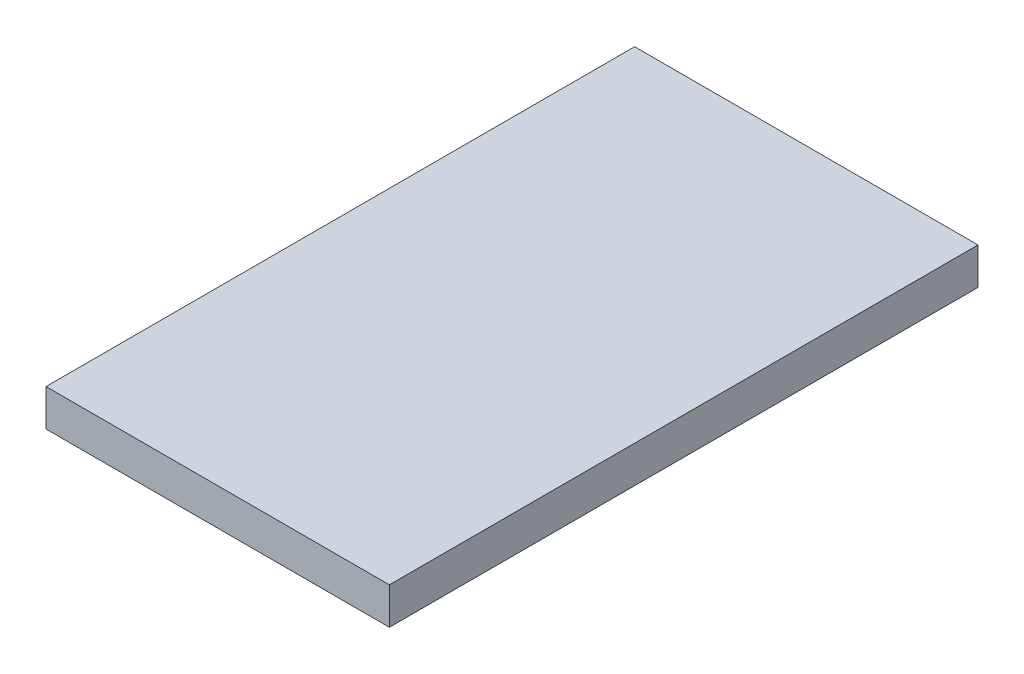
ISO-10303-21;
HEADER;
FILE_DESCRIPTION(('STEP AP214'),'2;1');
FILE_NAME('part.step','',(''),(''),'','','');
FILE_SCHEMA(('AUTOMOTIVE_DESIGN { 1 0 10303 214 1 1 1 1 }'));
ENDSEC;
DATA;
#1=APPLICATION_CONTEXT('core data for automotive mechanical design processes');
#2=APPLICATION_PROTOCOL_DEFINITION('international standard','automotive_design',2000,#1);
#3=PRODUCT_CONTEXT('',#1,'mechanical');
#4=PRODUCT('Part','Part','',(#3));
#5=PRODUCT_RELATED_PRODUCT_CATEGORY('part','',(#4));
#6=PRODUCT_DEFINITION_FORMATION('','',#4);
#7=PRODUCT_DEFINITION_CONTEXT('part definition',#1,'design');
#8=PRODUCT_DEFINITION('design','',#6,#7);
#9=PRODUCT_DEFINITION_SHAPE('','',#8);
#10=(LENGTH_UNIT() NAMED_UNIT(*) SI_UNIT(.MILLI.,.METRE.));
#11=(NAMED_UNIT(*) PLANE_ANGLE_UNIT() SI_UNIT($,.RADIAN.));
#12=(NAMED_UNIT(*) SI_UNIT($,.STERADIAN.) SOLID_ANGLE_UNIT());
#13=UNCERTAINTY_MEASURE_WITH_UNIT(LENGTH_MEASURE(1.E-05),#10,'distance_accuracy_value','');
#14=(GEOMETRIC_REPRESENTATION_CONTEXT(3) GLOBAL_UNCERTAINTY_ASSIGNED_CONTEXT((#13)) GLOBAL_UNIT_ASSIGNED_CONTEXT((#10,
#11,#12)) REPRESENTATION_CONTEXT('',''));
#15=CARTESIAN_POINT('',(0.,0.,0.));
#16=DIRECTION('',(0.,0.,1.));
#17=DIRECTION('',(1.,0.,0.));
#18=AXIS2_PLACEMENT_3D('',#15,#16,#17);
#19=CARTESIAN_POINT('',(88.9,9.525,152.4));
#20=DIRECTION('',(-1.,0.,0.));
#21=DIRECTION('',(0.,0.,1.));
#22=AXIS2_PLACEMENT_3D('',#19,#20,#21);
#23=PLANE('',#22);
#24=DIRECTION('',(0.,0.,-1.));
#25=VECTOR('',#24,1.);
#26=CARTESIAN_POINT('',(88.9,-9.525,152.4));
#27=LINE('',#26,#25);
#28=CARTESIAN_POINT('',(88.9,-9.525,152.4));
#29=VERTEX_POINT('',#28);
#30=CARTESIAN_POINT('',(88.9,-9.525,-152.4));
#31=VERTEX_POINT('',#30);
#32=EDGE_CURVE('E107',#29,#31,#27,.T.);
#33=ORIENTED_EDGE('',*,*,#32,.T.);
#34=DIRECTION('',(0.,-1.,0.));
#35=VECTOR('',#34,1.);
#36=CARTESIAN_POINT('',(88.9,9.525,-152.4));
#37=LINE('',#36,#35);
#38=CARTESIAN_POINT('',(88.9,9.525,-152.4));
#39=VERTEX_POINT('',#38);
#40=EDGE_CURVE('E11',#39,#31,#37,.T.);
#41=ORIENTED_EDGE('',*,*,#40,.F.);
#42=DIRECTION('',(0.,0.,-1.));
#43=VECTOR('',#42,1.);
#44=CARTESIAN_POINT('',(88.9,9.525,152.4));
#45=LINE('',#44,#43);
#46=CARTESIAN_POINT('',(88.9,9.525,152.4));
#47=VERTEX_POINT('',#46);
#48=EDGE_CURVE('E91',#47,#39,#45,.T.);
#49=ORIENTED_EDGE('',*,*,#48,.F.);
#50=DIRECTION('',(0.,-1.,0.));
#51=VECTOR('',#50,1.);
#52=CARTESIAN_POINT('',(88.9,9.525,152.4));
#53=LINE('',#52,#51);
#54=EDGE_CURVE('E103',#47,#29,#53,.T.);
#55=ORIENTED_EDGE('',*,*,#54,.T.);
#56=EDGE_LOOP('',(#33,#41,#49,#55));
#57=FACE_BOUND('',#56,.T.);
#58=ADVANCED_FACE('F39',(#57),#23,.F.);
#59=CARTESIAN_POINT('',(-88.9,9.525,-152.4));
#60=DIRECTION('',(0.,0.,1.));
#61=DIRECTION('',(1.,0.,0.));
#62=AXIS2_PLACEMENT_3D('',#59,#60,#61);
#63=PLANE('',#62);
#64=DIRECTION('',(-1.,0.,0.));
#65=VECTOR('',#64,1.);
#66=CARTESIAN_POINT('',(-88.9,-9.525,-152.4));
#67=LINE('',#66,#65);
#68=CARTESIAN_POINT('',(-88.9,-9.525,-152.4));
#69=VERTEX_POINT('',#68);
#70=EDGE_CURVE('E96',#31,#69,#67,.T.);
#71=ORIENTED_EDGE('',*,*,#70,.T.);
#72=DIRECTION('',(0.,-1.,0.));
#73=VECTOR('',#72,1.);
#74=CARTESIAN_POINT('',(-88.9,9.525,-152.4));
#75=LINE('',#74,#73);
#76=CARTESIAN_POINT('',(-88.9,9.525,-152.4));
#77=VERTEX_POINT('',#76);
#78=EDGE_CURVE('E48',#77,#69,#75,.T.);
#79=ORIENTED_EDGE('',*,*,#78,.F.);
#80=DIRECTION('',(-1.,0.,0.));
#81=VECTOR('',#80,1.);
#82=CARTESIAN_POINT('',(-88.9,9.525,-152.4));
#83=LINE('',#82,#81);
#84=EDGE_CURVE('E86',#39,#77,#83,.T.);
#85=ORIENTED_EDGE('',*,*,#84,.F.);
#86=ORIENTED_EDGE('',*,*,#40,.T.);
#87=EDGE_LOOP('',(#71,#79,#85,#86));
#88=FACE_BOUND('',#87,.T.);
#89=ADVANCED_FACE('F95',(#88),#63,.F.);
#90=CARTESIAN_POINT('',(-88.9,9.525,152.4));
#91=DIRECTION('',(1.,0.,0.));
#92=DIRECTION('',(0.,0.,-1.));
#93=AXIS2_PLACEMENT_3D('',#90,#91,#92);
#94=PLANE('',#93);
#95=DIRECTION('',(0.,0.,1.));
#96=VECTOR('',#95,1.);
#97=CARTESIAN_POINT('',(-88.9,-9.525,152.4));
#98=LINE('',#97,#96);
#99=CARTESIAN_POINT('',(-88.9,-9.525,152.4));
#100=VERTEX_POINT('',#99);
#101=EDGE_CURVE('E73',#69,#100,#98,.T.);
#102=ORIENTED_EDGE('',*,*,#101,.T.);
#103=DIRECTION('',(0.,-1.,0.));
#104=VECTOR('',#103,1.);
#105=CARTESIAN_POINT('',(-88.9,9.525,152.4));
#106=LINE('',#105,#104);
#107=CARTESIAN_POINT('',(-88.9,9.525,152.4));
#108=VERTEX_POINT('',#107);
#109=EDGE_CURVE('E98',#108,#100,#106,.T.);
#110=ORIENTED_EDGE('',*,*,#109,.F.);
#111=DIRECTION('',(0.,0.,1.));
#112=VECTOR('',#111,1.);
#113=CARTESIAN_POINT('',(-88.9,9.525,152.4));
#114=LINE('',#113,#112);
#115=EDGE_CURVE('E89',#77,#108,#114,.T.);
#116=ORIENTED_EDGE('',*,*,#115,.F.);
#117=ORIENTED_EDGE('',*,*,#78,.T.);
#118=EDGE_LOOP('',(#102,#110,#116,#117));
#119=FACE_BOUND('',#118,.T.);
#120=ADVANCED_FACE('F99',(#119),#94,.F.);
#121=CARTESIAN_POINT('',(-88.9,9.525,152.4));
#122=DIRECTION('',(0.,0.,-1.));
#123=DIRECTION('',(-1.,0.,0.));
#124=AXIS2_PLACEMENT_3D('',#121,#122,#123);
#125=PLANE('',#124);
#126=DIRECTION('',(1.,0.,0.));
#127=VECTOR('',#126,1.);
#128=CARTESIAN_POINT('',(-88.9,-9.525,152.4));
#129=LINE('',#128,#127);
#130=EDGE_CURVE('E79',#100,#29,#129,.T.);
#131=ORIENTED_EDGE('',*,*,#130,.T.);
#132=ORIENTED_EDGE('',*,*,#54,.F.);
#133=DIRECTION('',(1.,0.,0.));
#134=VECTOR('',#133,1.);
#135=CARTESIAN_POINT('',(-88.9,9.525,152.4));
#136=LINE('',#135,#134);
#137=EDGE_CURVE('E56',#108,#47,#136,.T.);
#138=ORIENTED_EDGE('',*,*,#137,.F.);
#139=ORIENTED_EDGE('',*,*,#109,.T.);
#140=EDGE_LOOP('',(#131,#132,#138,#139));
#141=FACE_BOUND('',#140,.T.);
#142=ADVANCED_FACE('F120',(#141),#125,.F.);
#143=CARTESIAN_POINT('',(0.,9.525,0.));
#144=DIRECTION('',(0.,-1.,0.));
#145=DIRECTION('',(0.,0.,-1.));
#146=AXIS2_PLACEMENT_3D('',#143,#144,#145);
#147=PLANE('',#146);
#148=ORIENTED_EDGE('',*,*,#48,.T.);
#149=ORIENTED_EDGE('',*,*,#84,.T.);
#150=ORIENTED_EDGE('',*,*,#115,.T.);
#151=ORIENTED_EDGE('',*,*,#137,.T.);
#152=EDGE_LOOP('',(#148,#149,#150,#151));
#153=FACE_BOUND('',#152,.T.);
#154=ADVANCED_FACE('F87',(#153),#147,.F.);
#155=CARTESIAN_POINT('',(0.,-9.525,0.));
#156=DIRECTION('',(0.,-1.,0.));
#157=DIRECTION('',(0.,0.,-1.));
#158=AXIS2_PLACEMENT_3D('',#155,#156,#157);
#159=PLANE('',#158);
#160=ORIENTED_EDGE('',*,*,#32,.F.);
#161=ORIENTED_EDGE('',*,*,#130,.F.);
#162=ORIENTED_EDGE('',*,*,#101,.F.);
#163=ORIENTED_EDGE('',*,*,#70,.F.);
#164=EDGE_LOOP('',(#160,#161,#162,#163));
#165=FACE_BOUND('',#164,.T.);
#166=ADVANCED_FACE('F123',(#165),#159,.T.);
#167=CLOSED_SHELL('',(#58,#89,#120,#142,#154,#166));
#168=MANIFOLD_SOLID_BREP('B2',#167);
#169=ADVANCED_BREP_SHAPE_REPRESENTATION('',(#18,#168),#14);
#170=SHAPE_DEFINITION_REPRESENTATION(#9,#169);
ENDSEC;
END-ISO-10303-21;
